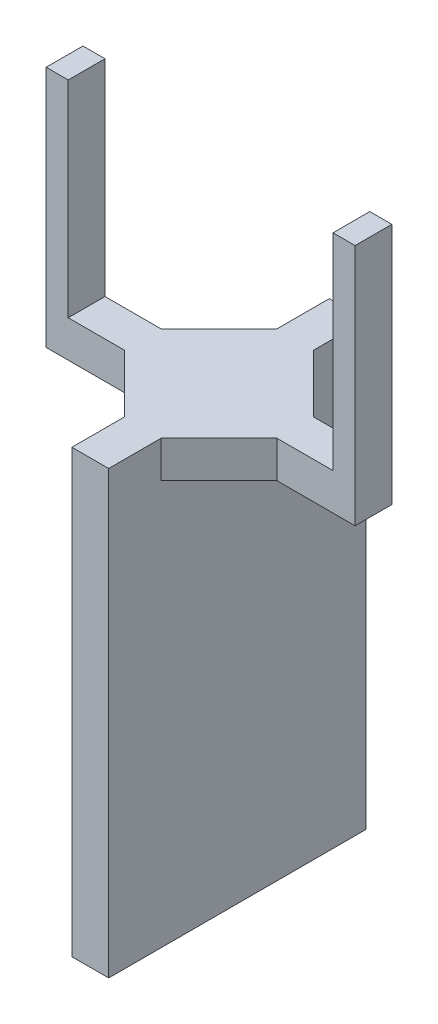
ISO-10303-21;
HEADER;
FILE_DESCRIPTION(('STEP AP214'),'2;1');
FILE_NAME('part.step','',(''),(''),'','','');
FILE_SCHEMA(('AUTOMOTIVE_DESIGN { 1 0 10303 214 1 1 1 1 }'));
ENDSEC;
DATA;
#1=APPLICATION_CONTEXT('core data for automotive mechanical design processes');
#2=APPLICATION_PROTOCOL_DEFINITION('international standard','automotive_design',2000,#1);
#3=PRODUCT_CONTEXT('',#1,'mechanical');
#4=PRODUCT('Part','Part','',(#3));
#5=PRODUCT_RELATED_PRODUCT_CATEGORY('part','',(#4));
#6=PRODUCT_DEFINITION_FORMATION('','',#4);
#7=PRODUCT_DEFINITION_CONTEXT('part definition',#1,'design');
#8=PRODUCT_DEFINITION('design','',#6,#7);
#9=PRODUCT_DEFINITION_SHAPE('','',#8);
#10=(LENGTH_UNIT() NAMED_UNIT(*) SI_UNIT(.MILLI.,.METRE.));
#11=(NAMED_UNIT(*) PLANE_ANGLE_UNIT() SI_UNIT($,.RADIAN.));
#12=(NAMED_UNIT(*) SI_UNIT($,.STERADIAN.) SOLID_ANGLE_UNIT());
#13=UNCERTAINTY_MEASURE_WITH_UNIT(LENGTH_MEASURE(1.E-05),#10,'distance_accuracy_value','');
#14=(GEOMETRIC_REPRESENTATION_CONTEXT(3) GLOBAL_UNCERTAINTY_ASSIGNED_CONTEXT((#13)) GLOBAL_UNIT_ASSIGNED_CONTEXT((#10,
#11,#12)) REPRESENTATION_CONTEXT('',''));
#15=CARTESIAN_POINT('',(0.,0.,0.));
#16=DIRECTION('',(0.,0.,1.));
#17=DIRECTION('',(1.,0.,0.));
#18=AXIS2_PLACEMENT_3D('',#15,#16,#17);
#19=CARTESIAN_POINT('',(-26.67,-6.99795918367346,3.175));
#20=DIRECTION('',(0.,1.,0.));
#21=DIRECTION('',(-1.,0.,0.));
#22=AXIS2_PLACEMENT_3D('',#19,#20,#21);
#23=PLANE('',#22);
#24=DIRECTION('',(0.,0.,-1.));
#25=VECTOR('',#24,1.);
#26=CARTESIAN_POINT('',(-3.175,-6.99795918367346,3.175));
#27=LINE('',#26,#25);
#28=CARTESIAN_POINT('',(-3.175,-6.99795918367346,13.175));
#29=VERTEX_POINT('',#28);
#30=CARTESIAN_POINT('',(-3.175,-6.99795918367346,-13.175));
#31=VERTEX_POINT('',#30);
#32=EDGE_CURVE('E220',#29,#31,#27,.T.);
#33=ORIENTED_EDGE('',*,*,#32,.F.);
#34=DIRECTION('',(-0.70710678118655,0.,-0.707106781186545));
#35=VECTOR('',#34,1.);
#36=CARTESIAN_POINT('',(-19.9225000000001,-6.99795918367346,-3.57249999999996));
#37=LINE('',#36,#35);
#38=CARTESIAN_POINT('',(-13.1750000000001,-6.99795918367346,3.175));
#39=VERTEX_POINT('',#38);
#40=EDGE_CURVE('E369',#29,#39,#37,.T.);
#41=ORIENTED_EDGE('',*,*,#40,.T.);
#42=DIRECTION('',(1.,0.,0.));
#43=VECTOR('',#42,1.);
#44=CARTESIAN_POINT('',(-26.67,-6.99795918367346,3.175));
#45=LINE('',#44,#43);
#46=CARTESIAN_POINT('',(-26.67,-6.99795918367346,3.175));
#47=VERTEX_POINT('',#46);
#48=EDGE_CURVE('E306',#47,#39,#45,.T.);
#49=ORIENTED_EDGE('',*,*,#48,.F.);
#50=DIRECTION('',(0.,0.,-1.));
#51=VECTOR('',#50,1.);
#52=CARTESIAN_POINT('',(-26.67,-6.99795918367346,3.175));
#53=LINE('',#52,#51);
#54=CARTESIAN_POINT('',(-26.67,-6.99795918367346,-3.175));
#55=VERTEX_POINT('',#54);
#56=EDGE_CURVE('E324',#47,#55,#53,.T.);
#57=ORIENTED_EDGE('',*,*,#56,.T.);
#58=DIRECTION('',(1.,0.,0.));
#59=VECTOR('',#58,1.);
#60=CARTESIAN_POINT('',(-26.67,-6.99795918367346,-3.175));
#61=LINE('',#60,#59);
#62=CARTESIAN_POINT('',(-13.1750000000001,-6.99795918367346,-3.175));
#63=VERTEX_POINT('',#62);
#64=EDGE_CURVE('E284',#55,#63,#61,.T.);
#65=ORIENTED_EDGE('',*,*,#64,.T.);
#66=DIRECTION('',(0.70710678118655,0.,-0.707106781186545));
#67=VECTOR('',#66,1.);
#68=CARTESIAN_POINT('',(-23.0975000000001,-6.99795918367346,6.74749999999994));
#69=LINE('',#68,#67);
#70=EDGE_CURVE('E379',#63,#31,#69,.T.);
#71=ORIENTED_EDGE('',*,*,#70,.T.);
#72=EDGE_LOOP('',(#33,#41,#49,#57,#65,#71));
#73=FACE_BOUND('',#72,.T.);
#74=ADVANCED_FACE('F45',(#73),#23,.F.);
#75=CARTESIAN_POINT('',(0.,0.,3.175));
#76=DIRECTION('',(0.,0.,1.));
#77=DIRECTION('',(1.,0.,0.));
#78=AXIS2_PLACEMENT_3D('',#75,#76,#77);
#79=PLANE('',#78);
#80=ORIENTED_EDGE('',*,*,#48,.T.);
#81=DIRECTION('',(0.,1.,0.));
#82=VECTOR('',#81,1.);
#83=CARTESIAN_POINT('',(-13.1750000000001,0.,3.175));
#84=LINE('',#83,#82);
#85=CARTESIAN_POINT('',(-13.1750000000001,-0.647959183673466,3.175));
#86=VERTEX_POINT('',#85);
#87=EDGE_CURVE('E337',#39,#86,#84,.T.);
#88=ORIENTED_EDGE('',*,*,#87,.T.);
#89=DIRECTION('',(-1.,0.,0.));
#90=VECTOR('',#89,1.);
#91=CARTESIAN_POINT('',(0.,-0.647959183673463,3.175));
#92=LINE('',#91,#90);
#93=CARTESIAN_POINT('',(-22.86,-0.647959183673468,3.175));
#94=VERTEX_POINT('',#93);
#95=EDGE_CURVE('E310',#86,#94,#92,.T.);
#96=ORIENTED_EDGE('',*,*,#95,.T.);
#97=DIRECTION('',(0.,1.,0.));
#98=VECTOR('',#97,1.);
#99=CARTESIAN_POINT('',(-22.86,-0.647959183673468,3.175));
#100=LINE('',#99,#98);
#101=CARTESIAN_POINT('',(-22.86,34.9120408163265,3.175));
#102=VERTEX_POINT('',#101);
#103=EDGE_CURVE('E315',#94,#102,#100,.T.);
#104=ORIENTED_EDGE('',*,*,#103,.T.);
#105=DIRECTION('',(-1.,0.,0.));
#106=VECTOR('',#105,1.);
#107=CARTESIAN_POINT('',(-22.86,34.9120408163265,3.175));
#108=LINE('',#107,#106);
#109=CARTESIAN_POINT('',(-26.67,34.9120408163265,3.175));
#110=VERTEX_POINT('',#109);
#111=EDGE_CURVE('E318',#102,#110,#108,.T.);
#112=ORIENTED_EDGE('',*,*,#111,.T.);
#113=DIRECTION('',(0.,-1.,0.));
#114=VECTOR('',#113,1.);
#115=CARTESIAN_POINT('',(-26.67,34.9120408163265,3.175));
#116=LINE('',#115,#114);
#117=EDGE_CURVE('E321',#110,#47,#116,.T.);
#118=ORIENTED_EDGE('',*,*,#117,.T.);
#119=EDGE_LOOP('',(#80,#88,#96,#104,#112,#118));
#120=FACE_BOUND('',#119,.T.);
#121=ADVANCED_FACE('F439',(#120),#79,.T.);
#122=CARTESIAN_POINT('',(0.,0.,-3.175));
#123=DIRECTION('',(0.,0.,-1.));
#124=DIRECTION('',(1.,0.,0.));
#125=AXIS2_PLACEMENT_3D('',#122,#123,#124);
#126=PLANE('',#125);
#127=DIRECTION('',(-1.,0.,0.));
#128=VECTOR('',#127,1.);
#129=CARTESIAN_POINT('',(0.,-0.647959183673463,-3.175));
#130=LINE('',#129,#128);
#131=CARTESIAN_POINT('',(-13.1750000000001,-0.647959183673466,-3.175));
#132=VERTEX_POINT('',#131);
#133=CARTESIAN_POINT('',(-22.86,-0.647959183673468,-3.175));
#134=VERTEX_POINT('',#133);
#135=EDGE_CURVE('E300',#132,#134,#130,.T.);
#136=ORIENTED_EDGE('',*,*,#135,.F.);
#137=DIRECTION('',(0.,-1.,0.));
#138=VECTOR('',#137,1.);
#139=CARTESIAN_POINT('',(-13.1750000000001,0.,-3.175));
#140=LINE('',#139,#138);
#141=EDGE_CURVE('E359',#132,#63,#140,.T.);
#142=ORIENTED_EDGE('',*,*,#141,.T.);
#143=ORIENTED_EDGE('',*,*,#64,.F.);
#144=DIRECTION('',(0.,-1.,0.));
#145=VECTOR('',#144,1.);
#146=CARTESIAN_POINT('',(-26.67,34.9120408163265,-3.175));
#147=LINE('',#146,#145);
#148=CARTESIAN_POINT('',(-26.67,34.9120408163265,-3.175));
#149=VERTEX_POINT('',#148);
#150=EDGE_CURVE('E288',#149,#55,#147,.T.);
#151=ORIENTED_EDGE('',*,*,#150,.F.);
#152=DIRECTION('',(-1.,0.,0.));
#153=VECTOR('',#152,1.);
#154=CARTESIAN_POINT('',(-22.86,34.9120408163265,-3.175));
#155=LINE('',#154,#153);
#156=CARTESIAN_POINT('',(-22.86,34.9120408163265,-3.175));
#157=VERTEX_POINT('',#156);
#158=EDGE_CURVE('E292',#157,#149,#155,.T.);
#159=ORIENTED_EDGE('',*,*,#158,.F.);
#160=DIRECTION('',(0.,1.,0.));
#161=VECTOR('',#160,1.);
#162=CARTESIAN_POINT('',(-22.86,-0.647959183673468,-3.175));
#163=LINE('',#162,#161);
#164=EDGE_CURVE('E296',#134,#157,#163,.T.);
#165=ORIENTED_EDGE('',*,*,#164,.F.);
#166=EDGE_LOOP('',(#136,#142,#143,#151,#159,#165));
#167=FACE_BOUND('',#166,.T.);
#168=ADVANCED_FACE('F430',(#167),#126,.T.);
#169=DIRECTION('',(0.,0.,1.));
#170=VECTOR('',#169,1.);
#171=CARTESIAN_POINT('',(3.175,-6.99795918367346,3.175));
#172=LINE('',#171,#170);
#173=CARTESIAN_POINT('',(3.175,-6.99795918367346,-13.175));
#174=VERTEX_POINT('',#173);
#175=CARTESIAN_POINT('',(3.175,-6.99795918367346,13.175));
#176=VERTEX_POINT('',#175);
#177=EDGE_CURVE('E244',#174,#176,#172,.T.);
#178=ORIENTED_EDGE('',*,*,#177,.F.);
#179=DIRECTION('',(0.70710678118655,0.,0.707106781186545));
#180=VECTOR('',#179,1.);
#181=CARTESIAN_POINT('',(-3.57250000000012,-6.99795918367346,-19.9225000000001));
#182=LINE('',#181,#180);
#183=CARTESIAN_POINT('',(13.1750000000001,-6.99795918367346,-3.175));
#184=VERTEX_POINT('',#183);
#185=EDGE_CURVE('E11',#174,#184,#182,.T.);
#186=ORIENTED_EDGE('',*,*,#185,.T.);
#187=CARTESIAN_POINT('',(26.67,-6.99795918367346,-3.175));
#188=VERTEX_POINT('',#187);
#189=EDGE_CURVE('E283',#184,#188,#61,.T.);
#190=ORIENTED_EDGE('',*,*,#189,.T.);
#191=DIRECTION('',(0.,0.,1.));
#192=VECTOR('',#191,1.);
#193=CARTESIAN_POINT('',(26.67,-6.99795918367346,-3.175));
#194=LINE('',#193,#192);
#195=CARTESIAN_POINT('',(26.67,-6.99795918367346,3.175));
#196=VERTEX_POINT('',#195);
#197=EDGE_CURVE('E269',#188,#196,#194,.T.);
#198=ORIENTED_EDGE('',*,*,#197,.T.);
#199=CARTESIAN_POINT('',(13.1750000000001,-6.99795918367346,3.175));
#200=VERTEX_POINT('',#199);
#201=EDGE_CURVE('E305',#200,#196,#45,.T.);
#202=ORIENTED_EDGE('',*,*,#201,.F.);
#203=DIRECTION('',(-0.70710678118655,0.,0.707106781186545));
#204=VECTOR('',#203,1.);
#205=CARTESIAN_POINT('',(-6.74750000000012,-6.99795918367346,23.0975));
#206=LINE('',#205,#204);
#207=EDGE_CURVE('E372',#200,#176,#206,.T.);
#208=ORIENTED_EDGE('',*,*,#207,.T.);
#209=EDGE_LOOP('',(#178,#186,#190,#198,#202,#208));
#210=FACE_BOUND('',#209,.T.);
#211=ADVANCED_FACE('F415',(#210),#23,.F.);
#212=CARTESIAN_POINT('',(22.86,-0.647959183673468,3.175));
#213=VERTEX_POINT('',#212);
#214=CARTESIAN_POINT('',(13.1750000000001,-0.64795918367346,3.175));
#215=VERTEX_POINT('',#214);
#216=EDGE_CURVE('E311',#213,#215,#92,.T.);
#217=ORIENTED_EDGE('',*,*,#216,.T.);
#218=DIRECTION('',(0.,-1.,0.));
#219=VECTOR('',#218,1.);
#220=CARTESIAN_POINT('',(13.1750000000001,0.,3.175));
#221=LINE('',#220,#219);
#222=EDGE_CURVE('E348',#215,#200,#221,.T.);
#223=ORIENTED_EDGE('',*,*,#222,.T.);
#224=ORIENTED_EDGE('',*,*,#201,.T.);
#225=DIRECTION('',(0.,-1.,0.));
#226=VECTOR('',#225,1.);
#227=CARTESIAN_POINT('',(26.67,34.9120408163265,3.175));
#228=LINE('',#227,#226);
#229=CARTESIAN_POINT('',(26.67,34.9120408163265,3.175));
#230=VERTEX_POINT('',#229);
#231=EDGE_CURVE('E247',#230,#196,#228,.T.);
#232=ORIENTED_EDGE('',*,*,#231,.F.);
#233=DIRECTION('',(1.,0.,0.));
#234=VECTOR('',#233,1.);
#235=CARTESIAN_POINT('',(22.86,34.9120408163265,3.175));
#236=LINE('',#235,#234);
#237=CARTESIAN_POINT('',(22.86,34.9120408163265,3.175));
#238=VERTEX_POINT('',#237);
#239=EDGE_CURVE('E251',#238,#230,#236,.T.);
#240=ORIENTED_EDGE('',*,*,#239,.F.);
#241=DIRECTION('',(0.,1.,0.));
#242=VECTOR('',#241,1.);
#243=CARTESIAN_POINT('',(22.86,-0.647959183673468,3.175));
#244=LINE('',#243,#242);
#245=EDGE_CURVE('E255',#213,#238,#244,.T.);
#246=ORIENTED_EDGE('',*,*,#245,.F.);
#247=EDGE_LOOP('',(#217,#223,#224,#232,#240,#246));
#248=FACE_BOUND('',#247,.T.);
#249=ADVANCED_FACE('F412',(#248),#79,.T.);
#250=ORIENTED_EDGE('',*,*,#189,.F.);
#251=DIRECTION('',(0.,1.,0.));
#252=VECTOR('',#251,1.);
#253=CARTESIAN_POINT('',(13.1750000000001,0.,-3.175));
#254=LINE('',#253,#252);
#255=CARTESIAN_POINT('',(13.1750000000001,-0.64795918367346,-3.175));
#256=VERTEX_POINT('',#255);
#257=EDGE_CURVE('E363',#184,#256,#254,.T.);
#258=ORIENTED_EDGE('',*,*,#257,.T.);
#259=CARTESIAN_POINT('',(22.86,-0.647959183673468,-3.175));
#260=VERTEX_POINT('',#259);
#261=EDGE_CURVE('E301',#260,#256,#130,.T.);
#262=ORIENTED_EDGE('',*,*,#261,.F.);
#263=DIRECTION('',(0.,1.,0.));
#264=VECTOR('',#263,1.);
#265=CARTESIAN_POINT('',(22.86,-0.647959183673468,-3.175));
#266=LINE('',#265,#264);
#267=CARTESIAN_POINT('',(22.86,34.9120408163265,-3.175));
#268=VERTEX_POINT('',#267);
#269=EDGE_CURVE('E259',#260,#268,#266,.T.);
#270=ORIENTED_EDGE('',*,*,#269,.T.);
#271=DIRECTION('',(1.,0.,0.));
#272=VECTOR('',#271,1.);
#273=CARTESIAN_POINT('',(22.86,34.9120408163265,-3.175));
#274=LINE('',#273,#272);
#275=CARTESIAN_POINT('',(26.67,34.9120408163265,-3.175));
#276=VERTEX_POINT('',#275);
#277=EDGE_CURVE('E262',#268,#276,#274,.T.);
#278=ORIENTED_EDGE('',*,*,#277,.T.);
#279=DIRECTION('',(0.,-1.,0.));
#280=VECTOR('',#279,1.);
#281=CARTESIAN_POINT('',(26.67,34.9120408163265,-3.175));
#282=LINE('',#281,#280);
#283=EDGE_CURVE('E265',#276,#188,#282,.T.);
#284=ORIENTED_EDGE('',*,*,#283,.T.);
#285=EDGE_LOOP('',(#250,#258,#262,#270,#278,#284));
#286=FACE_BOUND('',#285,.T.);
#287=ADVANCED_FACE('F392',(#286),#126,.T.);
#288=CARTESIAN_POINT('',(0.,-0.647959183673463,3.175));
#289=DIRECTION('',(0.,-1.,0.));
#290=DIRECTION('',(1.,0.,0.));
#291=AXIS2_PLACEMENT_3D('',#288,#289,#290);
#292=PLANE('',#291);
#293=DIRECTION('',(0.,0.,1.));
#294=VECTOR('',#293,1.);
#295=CARTESIAN_POINT('',(-3.175,-0.647959183673469,22.225));
#296=LINE('',#295,#294);
#297=CARTESIAN_POINT('',(-3.175,-0.647959183673468,-22.225));
#298=VERTEX_POINT('',#297);
#299=CARTESIAN_POINT('',(-3.175,-0.647959183673468,-13.175));
#300=VERTEX_POINT('',#299);
#301=EDGE_CURVE('E206',#298,#300,#296,.T.);
#302=ORIENTED_EDGE('',*,*,#301,.T.);
#303=DIRECTION('',(-0.70710678118655,0.,0.707106781186545));
#304=VECTOR('',#303,1.);
#305=CARTESIAN_POINT('',(-9.76249999999998,-0.647959183673465,-6.58750000000006));
#306=LINE('',#305,#304);
#307=EDGE_CURVE('E383',#300,#132,#306,.T.);
#308=ORIENTED_EDGE('',*,*,#307,.T.);
#309=ORIENTED_EDGE('',*,*,#135,.T.);
#310=DIRECTION('',(0.,0.,-1.));
#311=VECTOR('',#310,1.);
#312=CARTESIAN_POINT('',(-22.86,-0.647959183673468,3.175));
#313=LINE('',#312,#311);
#314=EDGE_CURVE('E333',#94,#134,#313,.T.);
#315=ORIENTED_EDGE('',*,*,#314,.F.);
#316=ORIENTED_EDGE('',*,*,#95,.F.);
#317=DIRECTION('',(0.70710678118655,0.,0.707106781186545));
#318=VECTOR('',#317,1.);
#319=CARTESIAN_POINT('',(-6.58749999999998,-0.647959183673464,9.76250000000003));
#320=LINE('',#319,#318);
#321=CARTESIAN_POINT('',(-3.175,-0.647959183673469,13.175));
#322=VERTEX_POINT('',#321);
#323=EDGE_CURVE('E366',#86,#322,#320,.T.);
#324=ORIENTED_EDGE('',*,*,#323,.T.);
#325=CARTESIAN_POINT('',(-3.175,-0.647959183673469,22.225));
#326=VERTEX_POINT('',#325);
#327=EDGE_CURVE('E215',#322,#326,#296,.T.);
#328=ORIENTED_EDGE('',*,*,#327,.T.);
#329=DIRECTION('',(-1.,0.,0.));
#330=VECTOR('',#329,1.);
#331=CARTESIAN_POINT('',(3.175,-0.647959183673469,22.225));
#332=LINE('',#331,#330);
#333=CARTESIAN_POINT('',(3.175,-0.647959183673469,22.225));
#334=VERTEX_POINT('',#333);
#335=EDGE_CURVE('E237',#334,#326,#332,.T.);
#336=ORIENTED_EDGE('',*,*,#335,.F.);
#337=DIRECTION('',(0.,0.,1.));
#338=VECTOR('',#337,1.);
#339=CARTESIAN_POINT('',(3.175,-0.647959183673469,22.225));
#340=LINE('',#339,#338);
#341=CARTESIAN_POINT('',(3.175,-0.647959183673469,13.175));
#342=VERTEX_POINT('',#341);
#343=EDGE_CURVE('E225',#342,#334,#340,.T.);
#344=ORIENTED_EDGE('',*,*,#343,.F.);
#345=DIRECTION('',(0.70710678118655,0.,-0.707106781186545));
#346=VECTOR('',#345,1.);
#347=CARTESIAN_POINT('',(6.58749999999998,-0.647959183673461,9.76250000000003));
#348=LINE('',#347,#346);
#349=EDGE_CURVE('E376',#342,#215,#348,.T.);
#350=ORIENTED_EDGE('',*,*,#349,.T.);
#351=ORIENTED_EDGE('',*,*,#216,.F.);
#352=DIRECTION('',(0.,0.,1.));
#353=VECTOR('',#352,1.);
#354=CARTESIAN_POINT('',(22.86,-0.647959183673468,-3.175));
#355=LINE('',#354,#353);
#356=EDGE_CURVE('E279',#260,#213,#355,.T.);
#357=ORIENTED_EDGE('',*,*,#356,.F.);
#358=ORIENTED_EDGE('',*,*,#261,.T.);
#359=DIRECTION('',(-0.70710678118655,0.,-0.707106781186545));
#360=VECTOR('',#359,1.);
#361=CARTESIAN_POINT('',(9.76249999999998,-0.647959183673461,-6.58750000000006));
#362=LINE('',#361,#360);
#363=CARTESIAN_POINT('',(3.175,-0.647959183673468,-13.175));
#364=VERTEX_POINT('',#363);
#365=EDGE_CURVE('E55',#256,#364,#362,.T.);
#366=ORIENTED_EDGE('',*,*,#365,.T.);
#367=CARTESIAN_POINT('',(3.175,-0.647959183673468,-22.225));
#368=VERTEX_POINT('',#367);
#369=EDGE_CURVE('E226',#368,#364,#340,.T.);
#370=ORIENTED_EDGE('',*,*,#369,.F.);
#371=DIRECTION('',(-1.,0.,0.));
#372=VECTOR('',#371,1.);
#373=CARTESIAN_POINT('',(3.175,-0.647959183673468,-22.225));
#374=LINE('',#373,#372);
#375=EDGE_CURVE('E241',#368,#298,#374,.T.);
#376=ORIENTED_EDGE('',*,*,#375,.T.);
#377=EDGE_LOOP('',(#302,#308,#309,#315,#316,#324,#328,#336,#344,#350,#351,#357,#358,#366,#370,#376));
#378=FACE_BOUND('',#377,.T.);
#379=ADVANCED_FACE('F387',(#378),#292,.F.);
#380=CARTESIAN_POINT('',(-22.86,-0.647959183673468,3.175));
#381=DIRECTION('',(-1.,0.,0.));
#382=DIRECTION('',(0.,0.,1.));
#383=AXIS2_PLACEMENT_3D('',#380,#381,#382);
#384=PLANE('',#383);
#385=ORIENTED_EDGE('',*,*,#314,.T.);
#386=ORIENTED_EDGE('',*,*,#164,.T.);
#387=DIRECTION('',(0.,0.,-1.));
#388=VECTOR('',#387,1.);
#389=CARTESIAN_POINT('',(-22.86,34.9120408163265,3.175));
#390=LINE('',#389,#388);
#391=EDGE_CURVE('E330',#102,#157,#390,.T.);
#392=ORIENTED_EDGE('',*,*,#391,.F.);
#393=ORIENTED_EDGE('',*,*,#103,.F.);
#394=EDGE_LOOP('',(#385,#386,#392,#393));
#395=FACE_BOUND('',#394,.T.);
#396=ADVANCED_FACE('F427',(#395),#384,.F.);
#397=CARTESIAN_POINT('',(-22.86,34.9120408163265,3.175));
#398=DIRECTION('',(0.,-1.,0.));
#399=DIRECTION('',(0.,0.,-1.));
#400=AXIS2_PLACEMENT_3D('',#397,#398,#399);
#401=PLANE('',#400);
#402=ORIENTED_EDGE('',*,*,#391,.T.);
#403=ORIENTED_EDGE('',*,*,#158,.T.);
#404=DIRECTION('',(0.,0.,-1.));
#405=VECTOR('',#404,1.);
#406=CARTESIAN_POINT('',(-26.67,34.9120408163265,3.175));
#407=LINE('',#406,#405);
#408=EDGE_CURVE('E327',#110,#149,#407,.T.);
#409=ORIENTED_EDGE('',*,*,#408,.F.);
#410=ORIENTED_EDGE('',*,*,#111,.F.);
#411=EDGE_LOOP('',(#402,#403,#409,#410));
#412=FACE_BOUND('',#411,.T.);
#413=ADVANCED_FACE('F435',(#412),#401,.F.);
#414=CARTESIAN_POINT('',(-26.67,34.9120408163265,3.175));
#415=DIRECTION('',(1.,0.,0.));
#416=DIRECTION('',(0.,1.,0.));
#417=AXIS2_PLACEMENT_3D('',#414,#415,#416);
#418=PLANE('',#417);
#419=ORIENTED_EDGE('',*,*,#408,.T.);
#420=ORIENTED_EDGE('',*,*,#150,.T.);
#421=ORIENTED_EDGE('',*,*,#56,.F.);
#422=ORIENTED_EDGE('',*,*,#117,.F.);
#423=EDGE_LOOP('',(#419,#420,#421,#422));
#424=FACE_BOUND('',#423,.T.);
#425=ADVANCED_FACE('F451',(#424),#418,.F.);
#426=CARTESIAN_POINT('',(22.86,-0.647959183673468,-3.175));
#427=DIRECTION('',(1.,0.,0.));
#428=DIRECTION('',(0.,0.,-1.));
#429=AXIS2_PLACEMENT_3D('',#426,#427,#428);
#430=PLANE('',#429);
#431=ORIENTED_EDGE('',*,*,#356,.T.);
#432=ORIENTED_EDGE('',*,*,#245,.T.);
#433=DIRECTION('',(0.,0.,1.));
#434=VECTOR('',#433,1.);
#435=CARTESIAN_POINT('',(22.86,34.9120408163265,-3.175));
#436=LINE('',#435,#434);
#437=EDGE_CURVE('E276',#268,#238,#436,.T.);
#438=ORIENTED_EDGE('',*,*,#437,.F.);
#439=ORIENTED_EDGE('',*,*,#269,.F.);
#440=EDGE_LOOP('',(#431,#432,#438,#439));
#441=FACE_BOUND('',#440,.T.);
#442=ADVANCED_FACE('F453',(#441),#430,.F.);
#443=CARTESIAN_POINT('',(22.86,34.9120408163265,-3.175));
#444=DIRECTION('',(0.,-1.,0.));
#445=DIRECTION('',(0.,0.,-1.));
#446=AXIS2_PLACEMENT_3D('',#443,#444,#445);
#447=PLANE('',#446);
#448=ORIENTED_EDGE('',*,*,#437,.T.);
#449=ORIENTED_EDGE('',*,*,#239,.T.);
#450=DIRECTION('',(0.,0.,1.));
#451=VECTOR('',#450,1.);
#452=CARTESIAN_POINT('',(26.67,34.9120408163265,-3.175));
#453=LINE('',#452,#451);
#454=EDGE_CURVE('E273',#276,#230,#453,.T.);
#455=ORIENTED_EDGE('',*,*,#454,.F.);
#456=ORIENTED_EDGE('',*,*,#277,.F.);
#457=EDGE_LOOP('',(#448,#449,#455,#456));
#458=FACE_BOUND('',#457,.T.);
#459=ADVANCED_FACE('F459',(#458),#447,.F.);
#460=CARTESIAN_POINT('',(26.67,34.9120408163265,-3.175));
#461=DIRECTION('',(-1.,0.,0.));
#462=DIRECTION('',(0.,-1.,0.));
#463=AXIS2_PLACEMENT_3D('',#460,#461,#462);
#464=PLANE('',#463);
#465=ORIENTED_EDGE('',*,*,#454,.T.);
#466=ORIENTED_EDGE('',*,*,#231,.T.);
#467=ORIENTED_EDGE('',*,*,#197,.F.);
#468=ORIENTED_EDGE('',*,*,#283,.F.);
#469=EDGE_LOOP('',(#465,#466,#467,#468));
#470=FACE_BOUND('',#469,.T.);
#471=ADVANCED_FACE('F517',(#470),#464,.F.);
#472=CARTESIAN_POINT('',(3.175,-76.8479591836735,-22.225));
#473=DIRECTION('',(0.,0.,1.));
#474=DIRECTION('',(1.,0.,0.));
#475=AXIS2_PLACEMENT_3D('',#472,#473,#474);
#476=PLANE('',#475);
#477=DIRECTION('',(-1.,0.,0.));
#478=VECTOR('',#477,1.);
#479=CARTESIAN_POINT('',(3.175,-76.8479591836735,-22.225));
#480=LINE('',#479,#478);
#481=CARTESIAN_POINT('',(3.175,-76.8479591836735,-22.225));
#482=VERTEX_POINT('',#481);
#483=CARTESIAN_POINT('',(-3.175,-76.8479591836735,-22.225));
#484=VERTEX_POINT('',#483);
#485=EDGE_CURVE('E183',#482,#484,#480,.T.);
#486=ORIENTED_EDGE('',*,*,#485,.T.);
#487=DIRECTION('',(0.,1.,0.));
#488=VECTOR('',#487,1.);
#489=CARTESIAN_POINT('',(-3.175,-76.8479591836735,-22.225));
#490=LINE('',#489,#488);
#491=EDGE_CURVE('E187',#484,#298,#490,.T.);
#492=ORIENTED_EDGE('',*,*,#491,.T.);
#493=ORIENTED_EDGE('',*,*,#375,.F.);
#494=DIRECTION('',(0.,1.,0.));
#495=VECTOR('',#494,1.);
#496=CARTESIAN_POINT('',(3.175,-76.8479591836735,-22.225));
#497=LINE('',#496,#495);
#498=EDGE_CURVE('E190',#482,#368,#497,.T.);
#499=ORIENTED_EDGE('',*,*,#498,.F.);
#500=EDGE_LOOP('',(#486,#492,#493,#499));
#501=FACE_BOUND('',#500,.T.);
#502=ADVANCED_FACE('F185',(#501),#476,.F.);
#503=CARTESIAN_POINT('',(3.175,-76.8479591836735,22.225));
#504=DIRECTION('',(0.,0.,-1.));
#505=DIRECTION('',(-1.,0.,0.));
#506=AXIS2_PLACEMENT_3D('',#503,#504,#505);
#507=PLANE('',#506);
#508=ORIENTED_EDGE('',*,*,#335,.T.);
#509=DIRECTION('',(0.,-1.,0.));
#510=VECTOR('',#509,1.);
#511=CARTESIAN_POINT('',(-3.175,-76.8479591836735,22.225));
#512=LINE('',#511,#510);
#513=CARTESIAN_POINT('',(-3.175,-76.8479591836735,22.225));
#514=VERTEX_POINT('',#513);
#515=EDGE_CURVE('E212',#326,#514,#512,.T.);
#516=ORIENTED_EDGE('',*,*,#515,.T.);
#517=DIRECTION('',(-1.,0.,0.));
#518=VECTOR('',#517,1.);
#519=CARTESIAN_POINT('',(3.175,-76.8479591836735,22.225));
#520=LINE('',#519,#518);
#521=CARTESIAN_POINT('',(3.175,-76.8479591836735,22.225));
#522=VERTEX_POINT('',#521);
#523=EDGE_CURVE('E195',#522,#514,#520,.T.);
#524=ORIENTED_EDGE('',*,*,#523,.F.);
#525=DIRECTION('',(0.,-1.,0.));
#526=VECTOR('',#525,1.);
#527=CARTESIAN_POINT('',(3.175,-76.8479591836735,22.225));
#528=LINE('',#527,#526);
#529=EDGE_CURVE('E230',#334,#522,#528,.T.);
#530=ORIENTED_EDGE('',*,*,#529,.F.);
#531=EDGE_LOOP('',(#508,#516,#524,#530));
#532=FACE_BOUND('',#531,.T.);
#533=ADVANCED_FACE('F404',(#532),#507,.F.);
#534=CARTESIAN_POINT('',(3.175,-76.8479591836735,22.225));
#535=DIRECTION('',(0.,1.,0.));
#536=DIRECTION('',(0.,0.,1.));
#537=AXIS2_PLACEMENT_3D('',#534,#535,#536);
#538=PLANE('',#537);
#539=ORIENTED_EDGE('',*,*,#523,.T.);
#540=DIRECTION('',(0.,0.,-1.));
#541=VECTOR('',#540,1.);
#542=CARTESIAN_POINT('',(-3.175,-76.8479591836735,22.225));
#543=LINE('',#542,#541);
#544=EDGE_CURVE('E203',#514,#484,#543,.T.);
#545=ORIENTED_EDGE('',*,*,#544,.T.);
#546=ORIENTED_EDGE('',*,*,#485,.F.);
#547=DIRECTION('',(0.,0.,-1.));
#548=VECTOR('',#547,1.);
#549=CARTESIAN_POINT('',(3.175,-76.8479591836735,22.225));
#550=LINE('',#549,#548);
#551=EDGE_CURVE('E196',#522,#482,#550,.T.);
#552=ORIENTED_EDGE('',*,*,#551,.F.);
#553=EDGE_LOOP('',(#539,#545,#546,#552));
#554=FACE_BOUND('',#553,.T.);
#555=ADVANCED_FACE('F209',(#554),#538,.F.);
#556=CARTESIAN_POINT('',(3.175,0.,0.));
#557=DIRECTION('',(-1.,0.,0.));
#558=DIRECTION('',(0.,0.,1.));
#559=AXIS2_PLACEMENT_3D('',#556,#557,#558);
#560=PLANE('',#559);
#561=ORIENTED_EDGE('',*,*,#177,.T.);
#562=DIRECTION('',(0.,1.,0.));
#563=VECTOR('',#562,1.);
#564=CARTESIAN_POINT('',(3.175,0.,13.175));
#565=LINE('',#564,#563);
#566=EDGE_CURVE('E356',#176,#342,#565,.T.);
#567=ORIENTED_EDGE('',*,*,#566,.T.);
#568=ORIENTED_EDGE('',*,*,#343,.T.);
#569=ORIENTED_EDGE('',*,*,#529,.T.);
#570=ORIENTED_EDGE('',*,*,#551,.T.);
#571=ORIENTED_EDGE('',*,*,#498,.T.);
#572=ORIENTED_EDGE('',*,*,#369,.T.);
#573=DIRECTION('',(0.,-1.,0.));
#574=VECTOR('',#573,1.);
#575=CARTESIAN_POINT('',(3.175,0.,-13.175));
#576=LINE('',#575,#574);
#577=EDGE_CURVE('E352',#364,#174,#576,.T.);
#578=ORIENTED_EDGE('',*,*,#577,.T.);
#579=EDGE_LOOP('',(#561,#567,#568,#569,#570,#571,#572,#578));
#580=FACE_BOUND('',#579,.T.);
#581=ADVANCED_FACE('F390',(#580),#560,.F.);
#582=CARTESIAN_POINT('',(-3.175,0.,0.));
#583=DIRECTION('',(1.,0.,0.));
#584=DIRECTION('',(0.,0.,1.));
#585=AXIS2_PLACEMENT_3D('',#582,#583,#584);
#586=PLANE('',#585);
#587=ORIENTED_EDGE('',*,*,#327,.F.);
#588=DIRECTION('',(0.,-1.,0.));
#589=VECTOR('',#588,1.);
#590=CARTESIAN_POINT('',(-3.175,0.,13.175));
#591=LINE('',#590,#589);
#592=EDGE_CURVE('E344',#322,#29,#591,.T.);
#593=ORIENTED_EDGE('',*,*,#592,.T.);
#594=ORIENTED_EDGE('',*,*,#32,.T.);
#595=DIRECTION('',(0.,1.,0.));
#596=VECTOR('',#595,1.);
#597=CARTESIAN_POINT('',(-3.175,0.,-13.175));
#598=LINE('',#597,#596);
#599=EDGE_CURVE('E341',#31,#300,#598,.T.);
#600=ORIENTED_EDGE('',*,*,#599,.T.);
#601=ORIENTED_EDGE('',*,*,#301,.F.);
#602=ORIENTED_EDGE('',*,*,#491,.F.);
#603=ORIENTED_EDGE('',*,*,#544,.F.);
#604=ORIENTED_EDGE('',*,*,#515,.F.);
#605=EDGE_LOOP('',(#587,#593,#594,#600,#601,#602,#603,#604));
#606=FACE_BOUND('',#605,.T.);
#607=ADVANCED_FACE('F201',(#606),#586,.F.);
#608=CARTESIAN_POINT('',(-13.1750000000001,0.,3.175));
#609=DIRECTION('',(0.707106781186545,0.,-0.707106781186551));
#610=DIRECTION('',(0.,1.,0.));
#611=AXIS2_PLACEMENT_3D('',#608,#609,#610);
#612=PLANE('',#611);
#613=ORIENTED_EDGE('',*,*,#40,.F.);
#614=ORIENTED_EDGE('',*,*,#592,.F.);
#615=ORIENTED_EDGE('',*,*,#323,.F.);
#616=ORIENTED_EDGE('',*,*,#87,.F.);
#617=EDGE_LOOP('',(#613,#614,#615,#616));
#618=FACE_BOUND('',#617,.T.);
#619=ADVANCED_FACE('F445',(#618),#612,.F.);
#620=CARTESIAN_POINT('',(13.1750000000001,0.,3.175));
#621=DIRECTION('',(-0.707106781186545,0.,-0.707106781186551));
#622=DIRECTION('',(0.,-1.,0.));
#623=AXIS2_PLACEMENT_3D('',#620,#621,#622);
#624=PLANE('',#623);
#625=ORIENTED_EDGE('',*,*,#349,.F.);
#626=ORIENTED_EDGE('',*,*,#566,.F.);
#627=ORIENTED_EDGE('',*,*,#207,.F.);
#628=ORIENTED_EDGE('',*,*,#222,.F.);
#629=EDGE_LOOP('',(#625,#626,#627,#628));
#630=FACE_BOUND('',#629,.T.);
#631=ADVANCED_FACE('F409',(#630),#624,.F.);
#632=CARTESIAN_POINT('',(-13.1750000000001,0.,-3.175));
#633=DIRECTION('',(0.707106781186545,0.,0.707106781186551));
#634=DIRECTION('',(0.,-1.,0.));
#635=AXIS2_PLACEMENT_3D('',#632,#633,#634);
#636=PLANE('',#635);
#637=ORIENTED_EDGE('',*,*,#307,.F.);
#638=ORIENTED_EDGE('',*,*,#599,.F.);
#639=ORIENTED_EDGE('',*,*,#70,.F.);
#640=ORIENTED_EDGE('',*,*,#141,.F.);
#641=EDGE_LOOP('',(#637,#638,#639,#640));
#642=FACE_BOUND('',#641,.T.);
#643=ADVANCED_FACE('F449',(#642),#636,.F.);
#644=CARTESIAN_POINT('',(13.1750000000001,0.,-3.175));
#645=DIRECTION('',(-0.707106781186545,0.,0.707106781186551));
#646=DIRECTION('',(0.,1.,0.));
#647=AXIS2_PLACEMENT_3D('',#644,#645,#646);
#648=PLANE('',#647);
#649=ORIENTED_EDGE('',*,*,#185,.F.);
#650=ORIENTED_EDGE('',*,*,#577,.F.);
#651=ORIENTED_EDGE('',*,*,#365,.F.);
#652=ORIENTED_EDGE('',*,*,#257,.F.);
#653=EDGE_LOOP('',(#649,#650,#651,#652));
#654=FACE_BOUND('',#653,.T.);
#655=ADVANCED_FACE('F48',(#654),#648,.F.);
#656=CLOSED_SHELL('',(#74,#121,#168,#211,#249,#287,#379,#396,#413,#425,#442,#459,#471,#502,#533,
#555,#581,#607,#619,#631,#643,#655));
#657=MANIFOLD_SOLID_BREP('B2',#656);
#658=ADVANCED_BREP_SHAPE_REPRESENTATION('',(#18,#657),#14);
#659=SHAPE_DEFINITION_REPRESENTATION(#9,#658);
ENDSEC;
END-ISO-10303-21;
